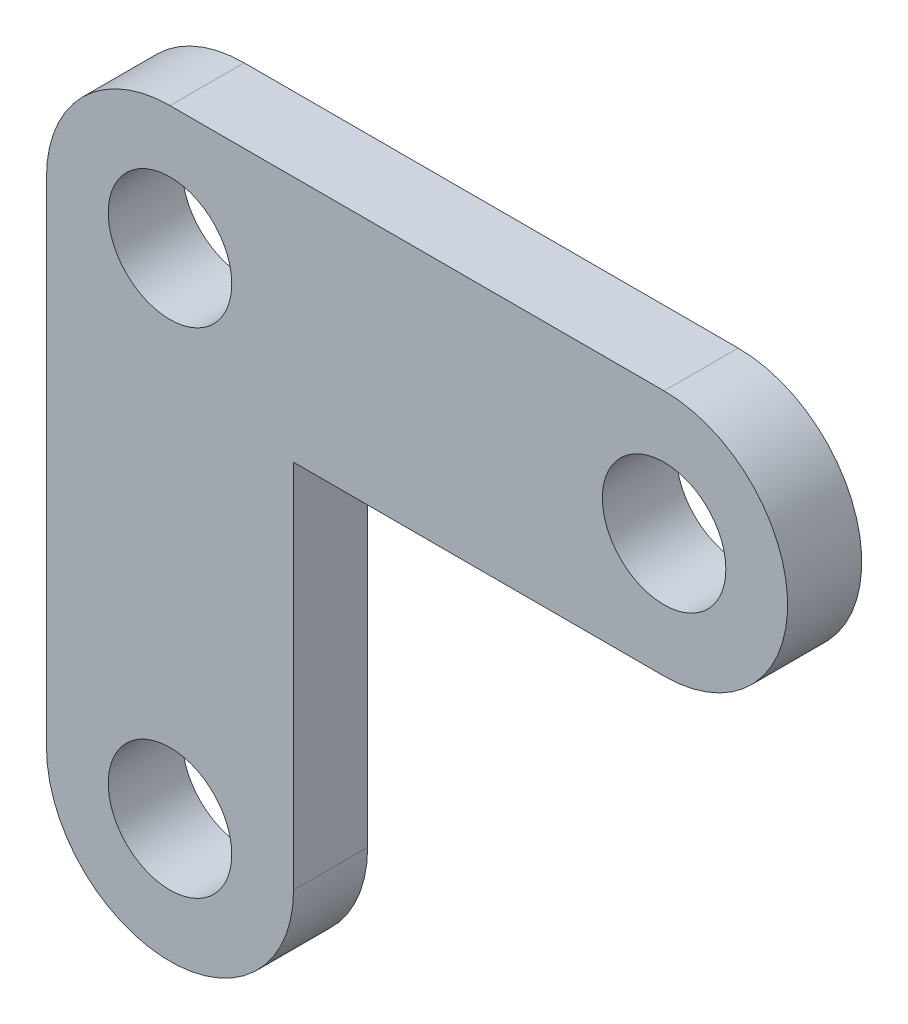
ISO-10303-21;
HEADER;
FILE_DESCRIPTION(('STEP AP214'),'2;1');
FILE_NAME('part.step','',(''),(''),'','','');
FILE_SCHEMA(('AUTOMOTIVE_DESIGN { 1 0 10303 214 1 1 1 1 }'));
ENDSEC;
DATA;
#1=APPLICATION_CONTEXT('core data for automotive mechanical design processes');
#2=APPLICATION_PROTOCOL_DEFINITION('international standard','automotive_design',2000,#1);
#3=PRODUCT_CONTEXT('',#1,'mechanical');
#4=PRODUCT('Part','Part','',(#3));
#5=PRODUCT_RELATED_PRODUCT_CATEGORY('part','',(#4));
#6=PRODUCT_DEFINITION_FORMATION('','',#4);
#7=PRODUCT_DEFINITION_CONTEXT('part definition',#1,'design');
#8=PRODUCT_DEFINITION('design','',#6,#7);
#9=PRODUCT_DEFINITION_SHAPE('','',#8);
#10=(LENGTH_UNIT() NAMED_UNIT(*) SI_UNIT(.MILLI.,.METRE.));
#11=(NAMED_UNIT(*) PLANE_ANGLE_UNIT() SI_UNIT($,.RADIAN.));
#12=(NAMED_UNIT(*) SI_UNIT($,.STERADIAN.) SOLID_ANGLE_UNIT());
#13=UNCERTAINTY_MEASURE_WITH_UNIT(LENGTH_MEASURE(1.E-05),#10,'distance_accuracy_value','');
#14=(GEOMETRIC_REPRESENTATION_CONTEXT(3) GLOBAL_UNCERTAINTY_ASSIGNED_CONTEXT((#13)) GLOBAL_UNIT_ASSIGNED_CONTEXT((#10,
#11,#12)) REPRESENTATION_CONTEXT('',''));
#15=CARTESIAN_POINT('',(0.,0.,0.));
#16=DIRECTION('',(0.,0.,1.));
#17=DIRECTION('',(1.,0.,0.));
#18=AXIS2_PLACEMENT_3D('',#15,#16,#17);
#19=CARTESIAN_POINT('',(14.001181793217,0.,3.));
#20=DIRECTION('',(-1.,0.,0.));
#21=DIRECTION('',(0.,-1.,0.));
#22=AXIS2_PLACEMENT_3D('',#19,#20,#21);
#23=PLANE('',#22);
#24=DIRECTION('',(0.,1.,0.));
#25=VECTOR('',#24,1.);
#26=CARTESIAN_POINT('',(14.001181793217,0.,0.));
#27=LINE('',#26,#25);
#28=CARTESIAN_POINT('',(14.001181793217,11.666122724896,0.));
#29=VERTEX_POINT('',#28);
#30=CARTESIAN_POINT('',(14.0011817932171,26.6661227248959,0.));
#31=VERTEX_POINT('',#30);
#32=EDGE_CURVE('E142',#29,#31,#27,.T.);
#33=ORIENTED_EDGE('',*,*,#32,.T.);
#34=DIRECTION('',(0.,0.,-1.));
#35=VECTOR('',#34,1.);
#36=CARTESIAN_POINT('',(14.0011817932171,26.6661227248959,3.));
#37=LINE('',#36,#35);
#38=CARTESIAN_POINT('',(14.0011817932171,26.6661227248959,3.));
#39=VERTEX_POINT('',#38);
#40=EDGE_CURVE('E11',#39,#31,#37,.T.);
#41=ORIENTED_EDGE('',*,*,#40,.F.);
#42=DIRECTION('',(0.,1.,0.));
#43=VECTOR('',#42,1.);
#44=CARTESIAN_POINT('',(14.001181793217,0.,3.));
#45=LINE('',#44,#43);
#46=CARTESIAN_POINT('',(14.001181793217,11.666122724896,3.));
#47=VERTEX_POINT('',#46);
#48=EDGE_CURVE('E167',#47,#39,#45,.T.);
#49=ORIENTED_EDGE('',*,*,#48,.F.);
#50=DIRECTION('',(0.,0.,-1.));
#51=VECTOR('',#50,1.);
#52=CARTESIAN_POINT('',(14.001181793217,11.666122724896,3.));
#53=LINE('',#52,#51);
#54=EDGE_CURVE('E141',#47,#29,#53,.T.);
#55=ORIENTED_EDGE('',*,*,#54,.T.);
#56=EDGE_LOOP('',(#33,#41,#49,#55));
#57=FACE_BOUND('',#56,.T.);
#58=ADVANCED_FACE('F43',(#57),#23,.F.);
#59=CARTESIAN_POINT('',(0.,26.6661227248959,3.));
#60=DIRECTION('',(0.,1.,0.));
#61=DIRECTION('',(0.,0.,1.));
#62=AXIS2_PLACEMENT_3D('',#59,#60,#61);
#63=PLANE('',#62);
#64=DIRECTION('',(1.,0.,0.));
#65=VECTOR('',#64,1.);
#66=CARTESIAN_POINT('',(0.,26.6661227248959,0.));
#67=LINE('',#66,#65);
#68=CARTESIAN_POINT('',(29.0011817932171,26.6661227248959,0.));
#69=VERTEX_POINT('',#68);
#70=EDGE_CURVE('E145',#31,#69,#67,.T.);
#71=ORIENTED_EDGE('',*,*,#70,.T.);
#72=DIRECTION('',(0.,0.,-1.));
#73=VECTOR('',#72,1.);
#74=CARTESIAN_POINT('',(29.0011817932171,26.6661227248959,3.));
#75=LINE('',#74,#73);
#76=CARTESIAN_POINT('',(29.0011817932171,26.6661227248959,3.));
#77=VERTEX_POINT('',#76);
#78=EDGE_CURVE('E51',#77,#69,#75,.T.);
#79=ORIENTED_EDGE('',*,*,#78,.F.);
#80=DIRECTION('',(1.,0.,0.));
#81=VECTOR('',#80,1.);
#82=CARTESIAN_POINT('',(0.,26.6661227248959,3.));
#83=LINE('',#82,#81);
#84=EDGE_CURVE('E95',#39,#77,#83,.T.);
#85=ORIENTED_EDGE('',*,*,#84,.F.);
#86=ORIENTED_EDGE('',*,*,#40,.T.);
#87=EDGE_LOOP('',(#71,#79,#85,#86));
#88=FACE_BOUND('',#87,.T.);
#89=ADVANCED_FACE('F177',(#88),#63,.F.);
#90=CARTESIAN_POINT('',(29.0011817932171,31.6661227248959,3.));
#91=DIRECTION('',(0.,0.,-1.));
#92=DIRECTION('',(-1.,0.,0.));
#93=AXIS2_PLACEMENT_3D('',#90,#91,#92);
#94=CYLINDRICAL_SURFACE('',#93,5.);
#95=CARTESIAN_POINT('',(29.0011817932171,31.6661227248959,0.));
#96=DIRECTION('',(0.,0.,1.));
#97=DIRECTION('',(1.,0.,0.));
#98=AXIS2_PLACEMENT_3D('',#95,#96,#97);
#99=CIRCLE('',#98,5.);
#100=CARTESIAN_POINT('',(29.0011817932171,36.6661227248959,0.));
#101=VERTEX_POINT('',#100);
#102=EDGE_CURVE('E148',#101,#69,#99,.F.);
#103=ORIENTED_EDGE('',*,*,#102,.F.);
#104=DIRECTION('',(0.,0.,-1.));
#105=VECTOR('',#104,1.);
#106=CARTESIAN_POINT('',(29.0011817932171,36.6661227248959,3.));
#107=LINE('',#106,#105);
#108=CARTESIAN_POINT('',(29.0011817932171,36.6661227248959,3.));
#109=VERTEX_POINT('',#108);
#110=EDGE_CURVE('E171',#109,#101,#107,.T.);
#111=ORIENTED_EDGE('',*,*,#110,.F.);
#112=CARTESIAN_POINT('',(29.0011817932171,31.6661227248959,3.));
#113=DIRECTION('',(0.,0.,1.));
#114=DIRECTION('',(1.,0.,0.));
#115=AXIS2_PLACEMENT_3D('',#112,#113,#114);
#116=CIRCLE('',#115,5.);
#117=EDGE_CURVE('E176',#109,#77,#116,.F.);
#118=ORIENTED_EDGE('',*,*,#117,.T.);
#119=ORIENTED_EDGE('',*,*,#78,.T.);
#120=EDGE_LOOP('',(#103,#111,#118,#119));
#121=FACE_BOUND('',#120,.T.);
#122=ADVANCED_FACE('F175',(#121),#94,.T.);
#123=CARTESIAN_POINT('',(0.,36.6661227248959,3.));
#124=DIRECTION('',(0.,1.,0.));
#125=DIRECTION('',(0.,0.,1.));
#126=AXIS2_PLACEMENT_3D('',#123,#124,#125);
#127=PLANE('',#126);
#128=DIRECTION('',(1.,0.,0.));
#129=VECTOR('',#128,1.);
#130=CARTESIAN_POINT('',(0.,36.6661227248959,0.));
#131=LINE('',#130,#129);
#132=CARTESIAN_POINT('',(9.00118179321707,36.6661227248959,0.));
#133=VERTEX_POINT('',#132);
#134=EDGE_CURVE('E151',#133,#101,#131,.T.);
#135=ORIENTED_EDGE('',*,*,#134,.F.);
#136=DIRECTION('',(0.,0.,-1.));
#137=VECTOR('',#136,1.);
#138=CARTESIAN_POINT('',(9.00118179321707,36.6661227248959,3.));
#139=LINE('',#138,#137);
#140=CARTESIAN_POINT('',(9.00118179321707,36.6661227248959,3.));
#141=VERTEX_POINT('',#140);
#142=EDGE_CURVE('E125',#141,#133,#139,.T.);
#143=ORIENTED_EDGE('',*,*,#142,.F.);
#144=DIRECTION('',(1.,0.,0.));
#145=VECTOR('',#144,1.);
#146=CARTESIAN_POINT('',(0.,36.6661227248959,3.));
#147=LINE('',#146,#145);
#148=EDGE_CURVE('E114',#141,#109,#147,.T.);
#149=ORIENTED_EDGE('',*,*,#148,.T.);
#150=ORIENTED_EDGE('',*,*,#110,.T.);
#151=EDGE_LOOP('',(#135,#143,#149,#150));
#152=FACE_BOUND('',#151,.T.);
#153=ADVANCED_FACE('F185',(#152),#127,.T.);
#154=CARTESIAN_POINT('',(9.00118179321707,31.6661227248961,3.));
#155=DIRECTION('',(0.,0.,-1.));
#156=DIRECTION('',(-1.,0.,0.));
#157=AXIS2_PLACEMENT_3D('',#154,#155,#156);
#158=CYLINDRICAL_SURFACE('',#157,4.9999999999999);
#159=CARTESIAN_POINT('',(9.00118179321707,31.6661227248961,0.));
#160=DIRECTION('',(0.,0.,1.));
#161=DIRECTION('',(1.,0.,0.));
#162=AXIS2_PLACEMENT_3D('',#159,#160,#161);
#163=CIRCLE('',#162,4.9999999999999);
#164=CARTESIAN_POINT('',(4.00118179321715,31.6661227248958,0.));
#165=VERTEX_POINT('',#164);
#166=EDGE_CURVE('E121',#133,#165,#163,.T.);
#167=ORIENTED_EDGE('',*,*,#166,.T.);
#168=DIRECTION('',(0.,0.,-1.));
#169=VECTOR('',#168,1.);
#170=CARTESIAN_POINT('',(4.00118179321715,31.6661227248958,3.));
#171=LINE('',#170,#169);
#172=CARTESIAN_POINT('',(4.00118179321715,31.6661227248958,3.));
#173=VERTEX_POINT('',#172);
#174=EDGE_CURVE('E118',#173,#165,#171,.T.);
#175=ORIENTED_EDGE('',*,*,#174,.F.);
#176=CARTESIAN_POINT('',(9.00118179321707,31.6661227248961,3.));
#177=DIRECTION('',(0.,0.,1.));
#178=DIRECTION('',(1.,0.,0.));
#179=AXIS2_PLACEMENT_3D('',#176,#177,#178);
#180=CIRCLE('',#179,4.9999999999999);
#181=EDGE_CURVE('E106',#141,#173,#180,.T.);
#182=ORIENTED_EDGE('',*,*,#181,.F.);
#183=ORIENTED_EDGE('',*,*,#142,.T.);
#184=EDGE_LOOP('',(#167,#175,#182,#183));
#185=FACE_BOUND('',#184,.T.);
#186=ADVANCED_FACE('F119',(#185),#158,.T.);
#187=CARTESIAN_POINT('',(4.00118179321702,0.,3.));
#188=DIRECTION('',(-1.,0.,0.));
#189=DIRECTION('',(0.,-1.,0.));
#190=AXIS2_PLACEMENT_3D('',#187,#188,#189);
#191=PLANE('',#190);
#192=DIRECTION('',(0.,1.,0.));
#193=VECTOR('',#192,1.);
#194=CARTESIAN_POINT('',(4.00118179321702,0.,0.));
#195=LINE('',#194,#193);
#196=CARTESIAN_POINT('',(4.00118179321707,11.6661227248958,0.));
#197=VERTEX_POINT('',#196);
#198=EDGE_CURVE('E155',#197,#165,#195,.T.);
#199=ORIENTED_EDGE('',*,*,#198,.F.);
#200=DIRECTION('',(0.,0.,-1.));
#201=VECTOR('',#200,1.);
#202=CARTESIAN_POINT('',(4.00118179321707,11.6661227248958,3.));
#203=LINE('',#202,#201);
#204=CARTESIAN_POINT('',(4.00118179321707,11.6661227248958,3.));
#205=VERTEX_POINT('',#204);
#206=EDGE_CURVE('E84',#205,#197,#203,.T.);
#207=ORIENTED_EDGE('',*,*,#206,.F.);
#208=DIRECTION('',(0.,1.,0.));
#209=VECTOR('',#208,1.);
#210=CARTESIAN_POINT('',(4.00118179321702,0.,3.));
#211=LINE('',#210,#209);
#212=EDGE_CURVE('E111',#205,#173,#211,.T.);
#213=ORIENTED_EDGE('',*,*,#212,.T.);
#214=ORIENTED_EDGE('',*,*,#174,.T.);
#215=EDGE_LOOP('',(#199,#207,#213,#214));
#216=FACE_BOUND('',#215,.T.);
#217=ADVANCED_FACE('F127',(#216),#191,.T.);
#218=CARTESIAN_POINT('',(29.0011817932171,31.6661227248959,3.));
#219=DIRECTION('',(0.,0.,-1.));
#220=DIRECTION('',(-1.,0.,0.));
#221=AXIS2_PLACEMENT_3D('',#218,#219,#220);
#222=CYLINDRICAL_SURFACE('',#221,2.5);
#223=CARTESIAN_POINT('',(29.0011817932171,31.6661227248959,3.));
#224=DIRECTION('',(0.,0.,1.));
#225=DIRECTION('',(1.,0.,0.));
#226=AXIS2_PLACEMENT_3D('',#223,#224,#225);
#227=CIRCLE('',#226,2.5);
#228=CARTESIAN_POINT('',(31.5011817932171,31.6661227248959,3.));
#229=VERTEX_POINT('',#228);
#230=EDGE_CURVE('E135',#229,#229,#227,.T.);
#231=ORIENTED_EDGE('',*,*,#230,.T.);
#232=EDGE_LOOP('',(#231));
#233=FACE_BOUND('',#232,.T.);
#234=CARTESIAN_POINT('',(29.0011817932171,31.6661227248959,0.));
#235=DIRECTION('',(0.,0.,1.));
#236=DIRECTION('',(1.,0.,0.));
#237=AXIS2_PLACEMENT_3D('',#234,#235,#236);
#238=CIRCLE('',#237,2.5);
#239=CARTESIAN_POINT('',(31.5011817932171,31.6661227248959,0.));
#240=VERTEX_POINT('',#239);
#241=EDGE_CURVE('E161',#240,#240,#238,.T.);
#242=ORIENTED_EDGE('',*,*,#241,.F.);
#243=EDGE_LOOP('',(#242));
#244=FACE_BOUND('',#243,.T.);
#245=ADVANCED_FACE('F202',(#233,#244),#222,.F.);
#246=CARTESIAN_POINT('',(9.00118179321707,31.6661227248961,3.));
#247=DIRECTION('',(0.,0.,-1.));
#248=DIRECTION('',(-1.,0.,0.));
#249=AXIS2_PLACEMENT_3D('',#246,#247,#248);
#250=CYLINDRICAL_SURFACE('',#249,2.5);
#251=CARTESIAN_POINT('',(9.00118179321707,31.6661227248961,3.));
#252=DIRECTION('',(0.,0.,1.));
#253=DIRECTION('',(1.,0.,0.));
#254=AXIS2_PLACEMENT_3D('',#251,#252,#253);
#255=CIRCLE('',#254,2.5);
#256=CARTESIAN_POINT('',(11.5011817932171,31.6661227248961,3.));
#257=VERTEX_POINT('',#256);
#258=EDGE_CURVE('E129',#257,#257,#255,.T.);
#259=ORIENTED_EDGE('',*,*,#258,.T.);
#260=EDGE_LOOP('',(#259));
#261=FACE_BOUND('',#260,.T.);
#262=CARTESIAN_POINT('',(9.00118179321707,31.6661227248961,0.));
#263=DIRECTION('',(0.,0.,1.));
#264=DIRECTION('',(1.,0.,0.));
#265=AXIS2_PLACEMENT_3D('',#262,#263,#264);
#266=CIRCLE('',#265,2.5);
#267=CARTESIAN_POINT('',(11.5011817932171,31.6661227248961,0.));
#268=VERTEX_POINT('',#267);
#269=EDGE_CURVE('E158',#268,#268,#266,.T.);
#270=ORIENTED_EDGE('',*,*,#269,.F.);
#271=EDGE_LOOP('',(#270));
#272=FACE_BOUND('',#271,.T.);
#273=ADVANCED_FACE('F194',(#261,#272),#250,.F.);
#274=CARTESIAN_POINT('',(9.00118179321708,11.6661227248957,3.));
#275=DIRECTION('',(0.,0.,-1.));
#276=DIRECTION('',(-1.,0.,0.));
#277=AXIS2_PLACEMENT_3D('',#274,#275,#276);
#278=CYLINDRICAL_SURFACE('',#277,4.99999999999997);
#279=CARTESIAN_POINT('',(9.00118179321708,11.6661227248957,0.));
#280=DIRECTION('',(0.,0.,1.));
#281=DIRECTION('',(1.,0.,0.));
#282=AXIS2_PLACEMENT_3D('',#279,#280,#281);
#283=CIRCLE('',#282,4.99999999999997);
#284=EDGE_CURVE('E87',#197,#29,#283,.T.);
#285=ORIENTED_EDGE('',*,*,#284,.T.);
#286=ORIENTED_EDGE('',*,*,#54,.F.);
#287=CARTESIAN_POINT('',(9.00118179321708,11.6661227248957,3.));
#288=DIRECTION('',(0.,0.,1.));
#289=DIRECTION('',(1.,0.,0.));
#290=AXIS2_PLACEMENT_3D('',#287,#288,#289);
#291=CIRCLE('',#290,4.99999999999997);
#292=EDGE_CURVE('E59',#205,#47,#291,.T.);
#293=ORIENTED_EDGE('',*,*,#292,.F.);
#294=ORIENTED_EDGE('',*,*,#206,.T.);
#295=EDGE_LOOP('',(#285,#286,#293,#294));
#296=FACE_BOUND('',#295,.T.);
#297=ADVANCED_FACE('F191',(#296),#278,.T.);
#298=CARTESIAN_POINT('',(9.00118179321708,11.6661227248957,3.));
#299=DIRECTION('',(0.,0.,-1.));
#300=DIRECTION('',(-1.,0.,0.));
#301=AXIS2_PLACEMENT_3D('',#298,#299,#300);
#302=CYLINDRICAL_SURFACE('',#301,2.5);
#303=CARTESIAN_POINT('',(9.00118179321708,11.6661227248957,3.));
#304=DIRECTION('',(0.,0.,1.));
#305=DIRECTION('',(1.,0.,0.));
#306=AXIS2_PLACEMENT_3D('',#303,#304,#305);
#307=CIRCLE('',#306,2.5);
#308=CARTESIAN_POINT('',(11.5011817932171,11.6661227248957,3.));
#309=VERTEX_POINT('',#308);
#310=EDGE_CURVE('E138',#309,#309,#307,.T.);
#311=ORIENTED_EDGE('',*,*,#310,.T.);
#312=EDGE_LOOP('',(#311));
#313=FACE_BOUND('',#312,.T.);
#314=CARTESIAN_POINT('',(9.00118179321708,11.6661227248957,0.));
#315=DIRECTION('',(0.,0.,1.));
#316=DIRECTION('',(1.,0.,0.));
#317=AXIS2_PLACEMENT_3D('',#314,#315,#316);
#318=CIRCLE('',#317,2.5);
#319=CARTESIAN_POINT('',(11.5011817932171,11.6661227248957,0.));
#320=VERTEX_POINT('',#319);
#321=EDGE_CURVE('E164',#320,#320,#318,.T.);
#322=ORIENTED_EDGE('',*,*,#321,.F.);
#323=EDGE_LOOP('',(#322));
#324=FACE_BOUND('',#323,.T.);
#325=ADVANCED_FACE('F193',(#313,#324),#302,.F.);
#326=CARTESIAN_POINT('',(0.,0.,3.));
#327=DIRECTION('',(0.,0.,1.));
#328=DIRECTION('',(1.,0.,0.));
#329=AXIS2_PLACEMENT_3D('',#326,#327,#328);
#330=PLANE('',#329);
#331=ORIENTED_EDGE('',*,*,#48,.T.);
#332=ORIENTED_EDGE('',*,*,#84,.T.);
#333=ORIENTED_EDGE('',*,*,#117,.F.);
#334=ORIENTED_EDGE('',*,*,#148,.F.);
#335=ORIENTED_EDGE('',*,*,#181,.T.);
#336=ORIENTED_EDGE('',*,*,#212,.F.);
#337=ORIENTED_EDGE('',*,*,#292,.T.);
#338=EDGE_LOOP('',(#331,#332,#333,#334,#335,#336,#337));
#339=FACE_BOUND('',#338,.T.);
#340=ORIENTED_EDGE('',*,*,#258,.F.);
#341=EDGE_LOOP('',(#340));
#342=FACE_BOUND('',#341,.T.);
#343=ORIENTED_EDGE('',*,*,#230,.F.);
#344=EDGE_LOOP('',(#343));
#345=FACE_BOUND('',#344,.T.);
#346=ORIENTED_EDGE('',*,*,#310,.F.);
#347=EDGE_LOOP('',(#346));
#348=FACE_BOUND('',#347,.T.);
#349=ADVANCED_FACE('F108',(#339,#342,#345,#348),#330,.T.);
#350=CARTESIAN_POINT('',(0.,0.,0.));
#351=DIRECTION('',(0.,0.,1.));
#352=DIRECTION('',(1.,0.,0.));
#353=AXIS2_PLACEMENT_3D('',#350,#351,#352);
#354=PLANE('',#353);
#355=ORIENTED_EDGE('',*,*,#32,.F.);
#356=ORIENTED_EDGE('',*,*,#284,.F.);
#357=ORIENTED_EDGE('',*,*,#198,.T.);
#358=ORIENTED_EDGE('',*,*,#166,.F.);
#359=ORIENTED_EDGE('',*,*,#134,.T.);
#360=ORIENTED_EDGE('',*,*,#102,.T.);
#361=ORIENTED_EDGE('',*,*,#70,.F.);
#362=EDGE_LOOP('',(#355,#356,#357,#358,#359,#360,#361));
#363=FACE_BOUND('',#362,.T.);
#364=ORIENTED_EDGE('',*,*,#269,.T.);
#365=EDGE_LOOP('',(#364));
#366=FACE_BOUND('',#365,.T.);
#367=ORIENTED_EDGE('',*,*,#241,.T.);
#368=EDGE_LOOP('',(#367));
#369=FACE_BOUND('',#368,.T.);
#370=ORIENTED_EDGE('',*,*,#321,.T.);
#371=EDGE_LOOP('',(#370));
#372=FACE_BOUND('',#371,.T.);
#373=ADVANCED_FACE('F181',(#363,#366,#369,#372),#354,.F.);
#374=CLOSED_SHELL('',(#58,#89,#122,#153,#186,#217,#245,#273,#297,#325,#349,#373));
#375=MANIFOLD_SOLID_BREP('B2',#374);
#376=ADVANCED_BREP_SHAPE_REPRESENTATION('',(#18,#375),#14);
#377=SHAPE_DEFINITION_REPRESENTATION(#9,#376);
ENDSEC;
END-ISO-10303-21;
